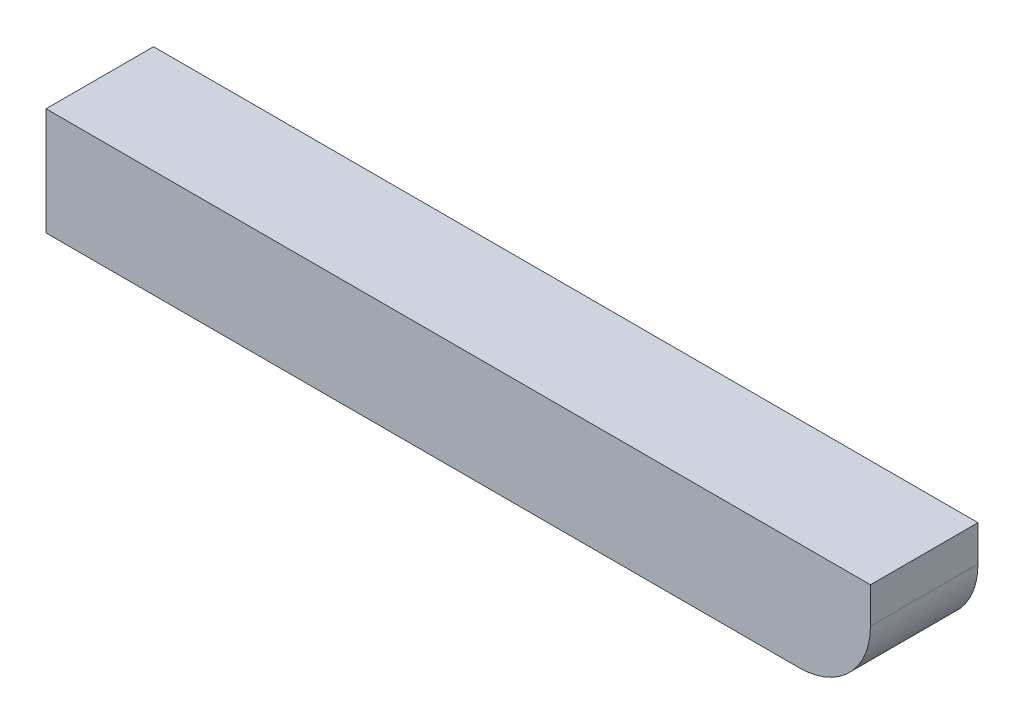
ISO-10303-21;
HEADER;
FILE_DESCRIPTION(('STEP AP214'),'2;1');
FILE_NAME('part.step','',(''),(''),'','','');
FILE_SCHEMA(('AUTOMOTIVE_DESIGN { 1 0 10303 214 1 1 1 1 }'));
ENDSEC;
DATA;
#1=APPLICATION_CONTEXT('core data for automotive mechanical design processes');
#2=APPLICATION_PROTOCOL_DEFINITION('international standard','automotive_design',2000,#1);
#3=PRODUCT_CONTEXT('',#1,'mechanical');
#4=PRODUCT('Part','Part','',(#3));
#5=PRODUCT_RELATED_PRODUCT_CATEGORY('part','',(#4));
#6=PRODUCT_DEFINITION_FORMATION('','',#4);
#7=PRODUCT_DEFINITION_CONTEXT('part definition',#1,'design');
#8=PRODUCT_DEFINITION('design','',#6,#7);
#9=PRODUCT_DEFINITION_SHAPE('','',#8);
#10=(LENGTH_UNIT() NAMED_UNIT(*) SI_UNIT(.MILLI.,.METRE.));
#11=(NAMED_UNIT(*) PLANE_ANGLE_UNIT() SI_UNIT($,.RADIAN.));
#12=(NAMED_UNIT(*) SI_UNIT($,.STERADIAN.) SOLID_ANGLE_UNIT());
#13=UNCERTAINTY_MEASURE_WITH_UNIT(LENGTH_MEASURE(1.E-05),#10,'distance_accuracy_value','');
#14=(GEOMETRIC_REPRESENTATION_CONTEXT(3) GLOBAL_UNCERTAINTY_ASSIGNED_CONTEXT((#13)) GLOBAL_UNIT_ASSIGNED_CONTEXT((#10,
#11,#12)) REPRESENTATION_CONTEXT('',''));
#15=CARTESIAN_POINT('',(0.,0.,0.));
#16=DIRECTION('',(0.,0.,1.));
#17=DIRECTION('',(1.,0.,0.));
#18=AXIS2_PLACEMENT_3D('',#15,#16,#17);
#19=CARTESIAN_POINT('',(-38.1664853101197,-3.69151251360175,15.));
#20=DIRECTION('',(0.,1.,0.));
#21=DIRECTION('',(0.,0.,1.));
#22=AXIS2_PLACEMENT_3D('',#19,#20,#21);
#23=PLANE('',#22);
#24=DIRECTION('',(1.,0.,0.));
#25=VECTOR('',#24,1.);
#26=CARTESIAN_POINT('',(-38.1664853101197,-3.69151251360175,0.));
#27=LINE('',#26,#25);
#28=CARTESIAN_POINT('',(-38.1664853101197,-3.69151251360175,0.));
#29=VERTEX_POINT('',#28);
#30=CARTESIAN_POINT('',(66.8335146898803,-3.69151251360175,0.));
#31=VERTEX_POINT('',#30);
#32=EDGE_CURVE('E113',#29,#31,#27,.T.);
#33=ORIENTED_EDGE('',*,*,#32,.T.);
#34=DIRECTION('',(0.,0.,-1.));
#35=VECTOR('',#34,1.);
#36=CARTESIAN_POINT('',(66.8335146898803,-3.69151251360175,15.));
#37=LINE('',#36,#35);
#38=CARTESIAN_POINT('',(66.8335146898803,-3.69151251360175,15.));
#39=VERTEX_POINT('',#38);
#40=EDGE_CURVE('E45',#31,#39,#37,.F.);
#41=ORIENTED_EDGE('',*,*,#40,.T.);
#42=DIRECTION('',(1.,0.,0.));
#43=VECTOR('',#42,1.);
#44=CARTESIAN_POINT('',(-38.1664853101197,-3.69151251360175,15.));
#45=LINE('',#44,#43);
#46=CARTESIAN_POINT('',(-38.1664853101197,-3.69151251360175,15.));
#47=VERTEX_POINT('',#46);
#48=EDGE_CURVE('E103',#47,#39,#45,.T.);
#49=ORIENTED_EDGE('',*,*,#48,.F.);
#50=DIRECTION('',(0.,0.,-1.));
#51=VECTOR('',#50,1.);
#52=CARTESIAN_POINT('',(-38.1664853101197,-3.69151251360175,15.));
#53=LINE('',#52,#51);
#54=EDGE_CURVE('E109',#47,#29,#53,.T.);
#55=ORIENTED_EDGE('',*,*,#54,.T.);
#56=EDGE_LOOP('',(#33,#41,#49,#55));
#57=FACE_BOUND('',#56,.T.);
#58=ADVANCED_FACE('F37',(#57),#23,.F.);
#59=CARTESIAN_POINT('',(76.8335146898803,11.3084874863983,15.));
#60=DIRECTION('',(1.,0.,0.));
#61=DIRECTION('',(0.,0.,-1.));
#62=AXIS2_PLACEMENT_3D('',#59,#60,#61);
#63=PLANE('',#62);
#64=DIRECTION('',(0.,-1.,0.));
#65=VECTOR('',#64,1.);
#66=CARTESIAN_POINT('',(76.8335146898803,11.3084874863983,15.));
#67=LINE('',#66,#65);
#68=CARTESIAN_POINT('',(76.8335146898803,11.3084874863983,15.));
#69=VERTEX_POINT('',#68);
#70=CARTESIAN_POINT('',(76.8335146898803,6.30848748639825,15.));
#71=VERTEX_POINT('',#70);
#72=EDGE_CURVE('E88',#69,#71,#67,.T.);
#73=ORIENTED_EDGE('',*,*,#72,.T.);
#74=DIRECTION('',(0.,0.,-1.));
#75=VECTOR('',#74,1.);
#76=CARTESIAN_POINT('',(76.8335146898803,6.30848748639825,0.));
#77=LINE('',#76,#75);
#78=CARTESIAN_POINT('',(76.8335146898803,6.30848748639825,0.));
#79=VERTEX_POINT('',#78);
#80=EDGE_CURVE('E95',#71,#79,#77,.T.);
#81=ORIENTED_EDGE('',*,*,#80,.T.);
#82=DIRECTION('',(0.,-1.,0.));
#83=VECTOR('',#82,1.);
#84=CARTESIAN_POINT('',(76.8335146898803,11.3084874863983,0.));
#85=LINE('',#84,#83);
#86=CARTESIAN_POINT('',(76.8335146898803,11.3084874863983,0.));
#87=VERTEX_POINT('',#86);
#88=EDGE_CURVE('E90',#87,#79,#85,.T.);
#89=ORIENTED_EDGE('',*,*,#88,.F.);
#90=DIRECTION('',(0.,0.,-1.));
#91=VECTOR('',#90,1.);
#92=CARTESIAN_POINT('',(76.8335146898803,11.3084874863983,15.));
#93=LINE('',#92,#91);
#94=EDGE_CURVE('E84',#69,#87,#93,.T.);
#95=ORIENTED_EDGE('',*,*,#94,.F.);
#96=EDGE_LOOP('',(#73,#81,#89,#95));
#97=FACE_BOUND('',#96,.T.);
#98=ADVANCED_FACE('F86',(#97),#63,.T.);
#99=CARTESIAN_POINT('',(-38.1664853101197,11.3084874863983,15.));
#100=DIRECTION('',(0.,1.,0.));
#101=DIRECTION('',(0.,0.,1.));
#102=AXIS2_PLACEMENT_3D('',#99,#100,#101);
#103=PLANE('',#102);
#104=DIRECTION('',(1.,0.,0.));
#105=VECTOR('',#104,1.);
#106=CARTESIAN_POINT('',(-38.1664853101197,11.3084874863983,0.));
#107=LINE('',#106,#105);
#108=CARTESIAN_POINT('',(-38.1664853101197,11.3084874863983,0.));
#109=VERTEX_POINT('',#108);
#110=EDGE_CURVE('E116',#109,#87,#107,.T.);
#111=ORIENTED_EDGE('',*,*,#110,.F.);
#112=DIRECTION('',(0.,0.,-1.));
#113=VECTOR('',#112,1.);
#114=CARTESIAN_POINT('',(-38.1664853101197,11.3084874863983,15.));
#115=LINE('',#114,#113);
#116=CARTESIAN_POINT('',(-38.1664853101197,11.3084874863983,15.));
#117=VERTEX_POINT('',#116);
#118=EDGE_CURVE('E96',#117,#109,#115,.T.);
#119=ORIENTED_EDGE('',*,*,#118,.F.);
#120=DIRECTION('',(1.,0.,0.));
#121=VECTOR('',#120,1.);
#122=CARTESIAN_POINT('',(-38.1664853101197,11.3084874863983,15.));
#123=LINE('',#122,#121);
#124=EDGE_CURVE('E101',#117,#69,#123,.T.);
#125=ORIENTED_EDGE('',*,*,#124,.T.);
#126=ORIENTED_EDGE('',*,*,#94,.T.);
#127=EDGE_LOOP('',(#111,#119,#125,#126));
#128=FACE_BOUND('',#127,.T.);
#129=ADVANCED_FACE('F105',(#128),#103,.T.);
#130=CARTESIAN_POINT('',(-38.1664853101197,11.3084874863983,15.));
#131=DIRECTION('',(1.,0.,0.));
#132=DIRECTION('',(0.,0.,-1.));
#133=AXIS2_PLACEMENT_3D('',#130,#131,#132);
#134=PLANE('',#133);
#135=DIRECTION('',(0.,-1.,0.));
#136=VECTOR('',#135,1.);
#137=CARTESIAN_POINT('',(-38.1664853101197,11.3084874863983,0.));
#138=LINE('',#137,#136);
#139=EDGE_CURVE('E118',#109,#29,#138,.T.);
#140=ORIENTED_EDGE('',*,*,#139,.T.);
#141=ORIENTED_EDGE('',*,*,#54,.F.);
#142=DIRECTION('',(0.,-1.,0.));
#143=VECTOR('',#142,1.);
#144=CARTESIAN_POINT('',(-38.1664853101197,11.3084874863983,15.));
#145=LINE('',#144,#143);
#146=EDGE_CURVE('E107',#117,#47,#145,.T.);
#147=ORIENTED_EDGE('',*,*,#146,.F.);
#148=ORIENTED_EDGE('',*,*,#118,.T.);
#149=EDGE_LOOP('',(#140,#141,#147,#148));
#150=FACE_BOUND('',#149,.T.);
#151=ADVANCED_FACE('F129',(#150),#134,.F.);
#152=CARTESIAN_POINT('',(0.,0.,15.));
#153=DIRECTION('',(0.,0.,-1.));
#154=DIRECTION('',(-1.,0.,0.));
#155=AXIS2_PLACEMENT_3D('',#152,#153,#154);
#156=PLANE('',#155);
#157=ORIENTED_EDGE('',*,*,#48,.T.);
#158=CARTESIAN_POINT('',(66.8335146898803,6.30848748639825,15.));
#159=DIRECTION('',(0.,0.,-1.));
#160=DIRECTION('',(-1.,0.,0.));
#161=AXIS2_PLACEMENT_3D('',#158,#159,#160);
#162=CIRCLE('',#161,10.);
#163=EDGE_CURVE('E11',#39,#71,#162,.F.);
#164=ORIENTED_EDGE('',*,*,#163,.T.);
#165=ORIENTED_EDGE('',*,*,#72,.F.);
#166=ORIENTED_EDGE('',*,*,#124,.F.);
#167=ORIENTED_EDGE('',*,*,#146,.T.);
#168=EDGE_LOOP('',(#157,#164,#165,#166,#167));
#169=FACE_BOUND('',#168,.T.);
#170=ADVANCED_FACE('F100',(#169),#156,.F.);
#171=CARTESIAN_POINT('',(0.,0.,0.));
#172=DIRECTION('',(0.,0.,-1.));
#173=DIRECTION('',(-1.,0.,0.));
#174=AXIS2_PLACEMENT_3D('',#171,#172,#173);
#175=PLANE('',#174);
#176=ORIENTED_EDGE('',*,*,#88,.T.);
#177=CARTESIAN_POINT('',(66.8335146898803,6.30848748639825,0.));
#178=DIRECTION('',(0.,0.,-1.));
#179=DIRECTION('',(-1.,0.,0.));
#180=AXIS2_PLACEMENT_3D('',#177,#178,#179);
#181=CIRCLE('',#180,10.);
#182=EDGE_CURVE('E59',#79,#31,#181,.T.);
#183=ORIENTED_EDGE('',*,*,#182,.T.);
#184=ORIENTED_EDGE('',*,*,#32,.F.);
#185=ORIENTED_EDGE('',*,*,#139,.F.);
#186=ORIENTED_EDGE('',*,*,#110,.T.);
#187=EDGE_LOOP('',(#176,#183,#184,#185,#186));
#188=FACE_BOUND('',#187,.T.);
#189=ADVANCED_FACE('F125',(#188),#175,.T.);
#190=CARTESIAN_POINT('',(66.8335146898803,6.30848748639825,15.));
#191=DIRECTION('',(0.,0.,1.));
#192=DIRECTION('',(1.,0.,0.));
#193=AXIS2_PLACEMENT_3D('',#190,#191,#192);
#194=CYLINDRICAL_SURFACE('',#193,10.);
#195=ORIENTED_EDGE('',*,*,#163,.F.);
#196=ORIENTED_EDGE('',*,*,#40,.F.);
#197=ORIENTED_EDGE('',*,*,#182,.F.);
#198=ORIENTED_EDGE('',*,*,#80,.F.);
#199=EDGE_LOOP('',(#195,#196,#197,#198));
#200=FACE_BOUND('',#199,.T.);
#201=ADVANCED_FACE('F39',(#200),#194,.T.);
#202=CLOSED_SHELL('',(#58,#98,#129,#151,#170,#189,#201));
#203=MANIFOLD_SOLID_BREP('B2',#202);
#204=ADVANCED_BREP_SHAPE_REPRESENTATION('',(#18,#203),#14);
#205=SHAPE_DEFINITION_REPRESENTATION(#9,#204);
ENDSEC;
END-ISO-10303-21;
